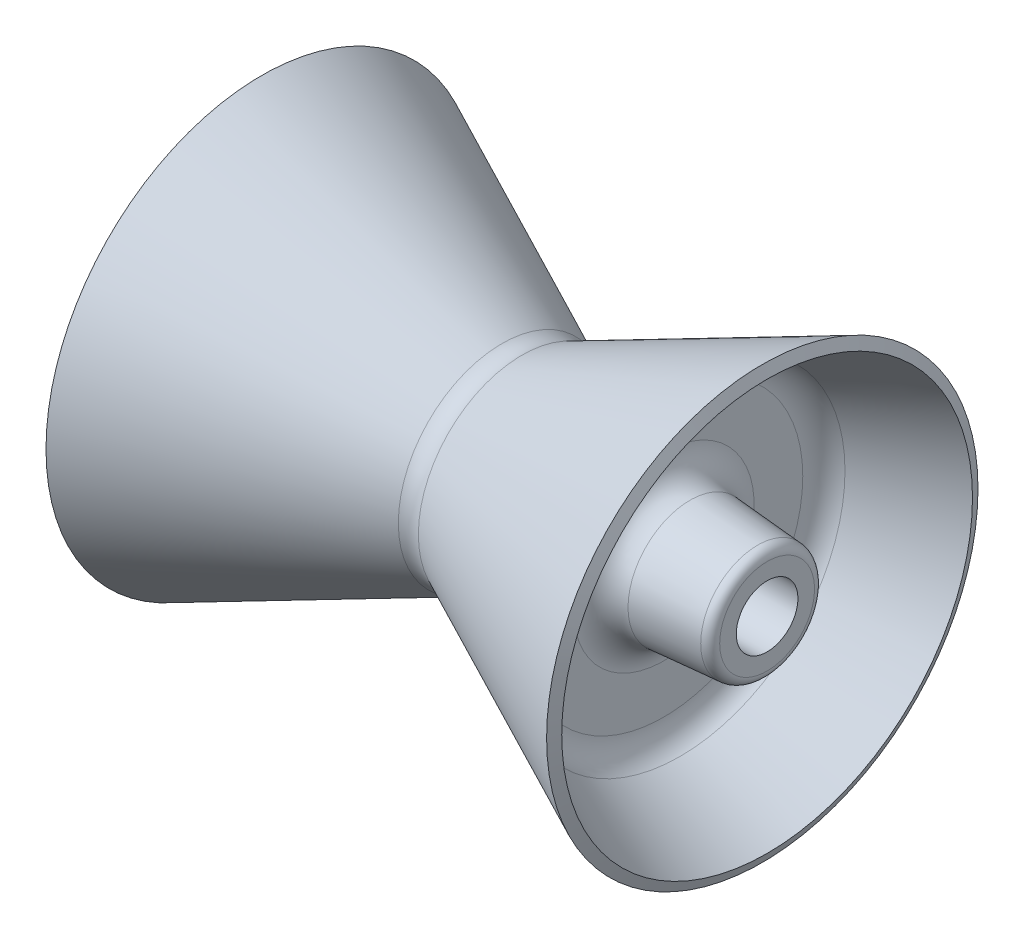
ISO-10303-21;
HEADER;
FILE_DESCRIPTION(('STEP AP214'),'2;1');
FILE_NAME('part.step','',(''),(''),'','','');
FILE_SCHEMA(('AUTOMOTIVE_DESIGN { 1 0 10303 214 1 1 1 1 }'));
ENDSEC;
DATA;
#1=APPLICATION_CONTEXT('core data for automotive mechanical design processes');
#2=APPLICATION_PROTOCOL_DEFINITION('international standard','automotive_design',2000,#1);
#3=PRODUCT_CONTEXT('',#1,'mechanical');
#4=PRODUCT('Part','Part','',(#3));
#5=PRODUCT_RELATED_PRODUCT_CATEGORY('part','',(#4));
#6=PRODUCT_DEFINITION_FORMATION('','',#4);
#7=PRODUCT_DEFINITION_CONTEXT('part definition',#1,'design');
#8=PRODUCT_DEFINITION('design','',#6,#7);
#9=PRODUCT_DEFINITION_SHAPE('','',#8);
#10=(LENGTH_UNIT() NAMED_UNIT(*) SI_UNIT(.MILLI.,.METRE.));
#11=(NAMED_UNIT(*) PLANE_ANGLE_UNIT() SI_UNIT($,.RADIAN.));
#12=(NAMED_UNIT(*) SI_UNIT($,.STERADIAN.) SOLID_ANGLE_UNIT());
#13=UNCERTAINTY_MEASURE_WITH_UNIT(LENGTH_MEASURE(1.E-05),#10,'distance_accuracy_value','');
#14=(GEOMETRIC_REPRESENTATION_CONTEXT(3) GLOBAL_UNCERTAINTY_ASSIGNED_CONTEXT((#13)) GLOBAL_UNIT_ASSIGNED_CONTEXT((#10,
#11,#12)) REPRESENTATION_CONTEXT('',''));
#15=CARTESIAN_POINT('',(0.,0.,0.));
#16=DIRECTION('',(0.,0.,1.));
#17=DIRECTION('',(1.,0.,0.));
#18=AXIS2_PLACEMENT_3D('',#15,#16,#17);
#19=CARTESIAN_POINT('',(130.,32.5,0.));
#20=DIRECTION('',(1.,0.,0.));
#21=DIRECTION('',(0.,0.,-1.));
#22=AXIS2_PLACEMENT_3D('',#19,#20,#21);
#23=PLANE('',#22);
#24=CARTESIAN_POINT('',(130.,0.,0.));
#25=DIRECTION('',(-1.,0.,0.));
#26=DIRECTION('',(0.,0.,1.));
#27=AXIS2_PLACEMENT_3D('',#24,#25,#26);
#28=CIRCLE('',#27,32.5);
#29=CARTESIAN_POINT('',(130.,0.,32.5));
#30=VERTEX_POINT('',#29);
#31=EDGE_CURVE('E10',#30,#30,#28,.T.);
#32=ORIENTED_EDGE('',*,*,#31,.F.);
#33=EDGE_LOOP('',(#32));
#34=FACE_BOUND('',#33,.T.);
#35=CARTESIAN_POINT('',(130.,0.,0.));
#36=DIRECTION('',(-1.,0.,0.));
#37=DIRECTION('',(0.,0.,1.));
#38=AXIS2_PLACEMENT_3D('',#35,#36,#37);
#39=CIRCLE('',#38,104.669980143619);
#40=CARTESIAN_POINT('',(130.,0.,104.669980143619));
#41=VERTEX_POINT('',#40);
#42=EDGE_CURVE('E124',#41,#41,#39,.T.);
#43=ORIENTED_EDGE('',*,*,#42,.T.);
#44=EDGE_LOOP('',(#43));
#45=FACE_BOUND('',#44,.T.);
#46=ADVANCED_FACE('F40',(#34,#45),#23,.F.);
#47=CARTESIAN_POINT('',(-518.63716742877,0.,0.));
#48=DIRECTION('',(-1.,0.,0.));
#49=DIRECTION('',(0.,0.,1.));
#50=AXIS2_PLACEMENT_3D('',#47,#48,#49);
#51=CYLINDRICAL_SURFACE('',#50,32.5);
#52=CARTESIAN_POINT('',(269.015,0.,0.));
#53=DIRECTION('',(-1.,0.,0.));
#54=DIRECTION('',(0.,0.,1.));
#55=AXIS2_PLACEMENT_3D('',#52,#53,#54);
#56=CIRCLE('',#55,32.5);
#57=CARTESIAN_POINT('',(269.015,0.,32.5));
#58=VERTEX_POINT('',#57);
#59=EDGE_CURVE('E43',#58,#58,#56,.T.);
#60=ORIENTED_EDGE('',*,*,#59,.F.);
#61=EDGE_LOOP('',(#60));
#62=FACE_BOUND('',#61,.T.);
#63=ORIENTED_EDGE('',*,*,#31,.T.);
#64=EDGE_LOOP('',(#63));
#65=FACE_BOUND('',#64,.T.);
#66=ADVANCED_FACE('F285',(#62,#65),#51,.F.);
#67=CARTESIAN_POINT('',(269.015,32.5,0.));
#68=DIRECTION('',(-1.,0.,0.));
#69=DIRECTION('',(0.,0.,1.));
#70=AXIS2_PLACEMENT_3D('',#67,#68,#69);
#71=PLANE('',#70);
#72=CARTESIAN_POINT('',(269.015,0.,0.));
#73=DIRECTION('',(-1.,0.,0.));
#74=DIRECTION('',(0.,0.,1.));
#75=AXIS2_PLACEMENT_3D('',#72,#73,#74);
#76=CIRCLE('',#75,50.);
#77=CARTESIAN_POINT('',(269.015,0.,50.));
#78=VERTEX_POINT('',#77);
#79=EDGE_CURVE('E50',#78,#78,#76,.T.);
#80=ORIENTED_EDGE('',*,*,#79,.F.);
#81=EDGE_LOOP('',(#80));
#82=FACE_BOUND('',#81,.T.);
#83=ORIENTED_EDGE('',*,*,#59,.T.);
#84=EDGE_LOOP('',(#83));
#85=FACE_BOUND('',#84,.T.);
#86=ADVANCED_FACE('F280',(#82,#85),#71,.F.);
#87=CARTESIAN_POINT('',(259.015,0.,0.));
#88=DIRECTION('',(-1.,0.,0.));
#89=DIRECTION('',(0.,0.,1.));
#90=AXIS2_PLACEMENT_3D('',#87,#88,#89);
#91=TOROIDAL_SURFACE('',#90,50.,10.);
#92=CARTESIAN_POINT('',(259.015,0.,0.));
#93=DIRECTION('',(-1.,0.,0.));
#94=DIRECTION('',(0.,0.,1.));
#95=AXIS2_PLACEMENT_3D('',#92,#93,#94);
#96=CIRCLE('',#95,60.);
#97=CARTESIAN_POINT('',(259.015,0.,60.));
#98=VERTEX_POINT('',#97);
#99=EDGE_CURVE('E51',#98,#98,#96,.T.);
#100=ORIENTED_EDGE('',*,*,#99,.F.);
#101=EDGE_LOOP('',(#100));
#102=FACE_BOUND('',#101,.T.);
#103=ORIENTED_EDGE('',*,*,#79,.T.);
#104=EDGE_LOOP('',(#103));
#105=FACE_BOUND('',#104,.T.);
#106=ADVANCED_FACE('F271',(#102,#105),#91,.T.);
#107=CARTESIAN_POINT('',(259.015,0.,0.));
#108=DIRECTION('',(-1.,0.,0.));
#109=DIRECTION('',(0.,0.,1.));
#110=AXIS2_PLACEMENT_3D('',#107,#108,#109);
#111=CONICAL_SURFACE('',#110,60.,0.0756017320365091);
#112=CARTESIAN_POINT('',(187.734107976115,0.,0.));
#113=DIRECTION('',(-1.,0.,0.));
#114=DIRECTION('',(0.,0.,1.));
#115=AXIS2_PLACEMENT_3D('',#112,#113,#114);
#116=CIRCLE('',#115,65.3992495094596);
#117=CARTESIAN_POINT('',(187.734107976115,0.,65.3992495094596));
#118=VERTEX_POINT('',#117);
#119=EDGE_CURVE('E57',#118,#118,#116,.T.);
#120=ORIENTED_EDGE('',*,*,#119,.F.);
#121=EDGE_LOOP('',(#120));
#122=FACE_BOUND('',#121,.T.);
#123=ORIENTED_EDGE('',*,*,#99,.T.);
#124=EDGE_LOOP('',(#123));
#125=FACE_BOUND('',#124,.T.);
#126=ADVANCED_FACE('F262',(#122,#125),#111,.T.);
#127=CARTESIAN_POINT('',(190.,0.,0.));
#128=DIRECTION('',(-1.,0.,0.));
#129=DIRECTION('',(0.,0.,1.));
#130=AXIS2_PLACEMENT_3D('',#127,#128,#129);
#131=TOROIDAL_SURFACE('',#130,95.3135560087935,30.);
#132=CARTESIAN_POINT('',(160.,0.,0.));
#133=DIRECTION('',(-1.,0.,0.));
#134=DIRECTION('',(0.,0.,1.));
#135=AXIS2_PLACEMENT_3D('',#132,#133,#134);
#136=CIRCLE('',#135,95.3135560087935);
#137=CARTESIAN_POINT('',(160.,0.,95.3135560087935));
#138=VERTEX_POINT('',#137);
#139=EDGE_CURVE('E56',#138,#138,#136,.T.);
#140=ORIENTED_EDGE('',*,*,#139,.F.);
#141=EDGE_LOOP('',(#140));
#142=FACE_BOUND('',#141,.T.);
#143=ORIENTED_EDGE('',*,*,#119,.T.);
#144=EDGE_LOOP('',(#143));
#145=FACE_BOUND('',#144,.T.);
#146=ADVANCED_FACE('F260',(#142,#145),#131,.F.);
#147=CARTESIAN_POINT('',(160.,95.3135560087937,0.));
#148=DIRECTION('',(-1.,0.,0.));
#149=DIRECTION('',(0.,0.,1.));
#150=AXIS2_PLACEMENT_3D('',#147,#148,#149);
#151=PLANE('',#150);
#152=CARTESIAN_POINT('',(160.,0.,0.));
#153=DIRECTION('',(-1.,0.,0.));
#154=DIRECTION('',(0.,0.,1.));
#155=AXIS2_PLACEMENT_3D('',#152,#153,#154);
#156=CIRCLE('',#155,146.637669377569);
#157=CARTESIAN_POINT('',(160.,0.,146.637669377569));
#158=VERTEX_POINT('',#157);
#159=EDGE_CURVE('E62',#158,#158,#156,.T.);
#160=ORIENTED_EDGE('',*,*,#159,.F.);
#161=EDGE_LOOP('',(#160));
#162=FACE_BOUND('',#161,.T.);
#163=ORIENTED_EDGE('',*,*,#139,.T.);
#164=EDGE_LOOP('',(#163));
#165=FACE_BOUND('',#164,.T.);
#166=ADVANCED_FACE('F254',(#162,#165),#151,.F.);
#167=CARTESIAN_POINT('',(190.,0.,0.));
#168=DIRECTION('',(-1.,0.,0.));
#169=DIRECTION('',(0.,0.,1.));
#170=AXIS2_PLACEMENT_3D('',#167,#168,#169);
#171=TOROIDAL_SURFACE('',#170,146.637669377569,30.);
#172=CARTESIAN_POINT('',(177.321452147779,0.,0.));
#173=DIRECTION('',(-1.,0.,0.));
#174=DIRECTION('',(0.,0.,1.));
#175=AXIS2_PLACEMENT_3D('',#172,#173,#174);
#176=CIRCLE('',#175,173.826902988668);
#177=CARTESIAN_POINT('',(177.321452147779,0.,173.826902988668));
#178=VERTEX_POINT('',#177);
#179=EDGE_CURVE('E65',#178,#178,#176,.T.);
#180=ORIENTED_EDGE('',*,*,#179,.F.);
#181=EDGE_LOOP('',(#180));
#182=FACE_BOUND('',#181,.T.);
#183=ORIENTED_EDGE('',*,*,#159,.T.);
#184=EDGE_LOOP('',(#183));
#185=FACE_BOUND('',#184,.T.);
#186=ADVANCED_FACE('F250',(#182,#185),#171,.F.);
#187=CARTESIAN_POINT('',(177.321452147779,0.,0.));
#188=DIRECTION('',(1.,0.,0.));
#189=DIRECTION('',(0.,0.,-1.));
#190=AXIS2_PLACEMENT_3D('',#187,#188,#189);
#191=CONICAL_SURFACE('',#190,173.826902988668,0.43633231299858);
#192=CARTESIAN_POINT('',(269.015,0.,0.));
#193=DIRECTION('',(-1.,0.,0.));
#194=DIRECTION('',(0.,0.,1.));
#195=AXIS2_PLACEMENT_3D('',#192,#193,#194);
#196=CIRCLE('',#195,216.58430655556);
#197=CARTESIAN_POINT('',(269.015,0.,216.58430655556));
#198=VERTEX_POINT('',#197);
#199=EDGE_CURVE('E66',#198,#198,#196,.T.);
#200=ORIENTED_EDGE('',*,*,#199,.F.);
#201=EDGE_LOOP('',(#200));
#202=FACE_BOUND('',#201,.T.);
#203=ORIENTED_EDGE('',*,*,#179,.T.);
#204=EDGE_LOOP('',(#203));
#205=FACE_BOUND('',#204,.T.);
#206=ADVANCED_FACE('F241',(#202,#205),#191,.F.);
#207=CARTESIAN_POINT('',(269.015,0.,0.));
#208=DIRECTION('',(-1.,0.,0.));
#209=DIRECTION('',(0.,0.,1.));
#210=AXIS2_PLACEMENT_3D('',#207,#208,#209);
#211=CONICAL_SURFACE('',#210,216.58430655556,1.13446401379632);
#212=CARTESIAN_POINT('',(263.943580859112,0.,0.));
#213=DIRECTION('',(-1.,0.,0.));
#214=DIRECTION('',(0.,0.,1.));
#215=AXIS2_PLACEMENT_3D('',#212,#213,#214);
#216=CIRCLE('',#215,227.46);
#217=CARTESIAN_POINT('',(263.943580859112,0.,227.46));
#218=VERTEX_POINT('',#217);
#219=EDGE_CURVE('E71',#218,#218,#216,.T.);
#220=ORIENTED_EDGE('',*,*,#219,.F.);
#221=EDGE_LOOP('',(#220));
#222=FACE_BOUND('',#221,.T.);
#223=ORIENTED_EDGE('',*,*,#199,.T.);
#224=EDGE_LOOP('',(#223));
#225=FACE_BOUND('',#224,.T.);
#226=ADVANCED_FACE('F234',(#222,#225),#211,.T.);
#227=CARTESIAN_POINT('',(263.943580859112,0.,0.));
#228=DIRECTION('',(1.,0.,0.));
#229=DIRECTION('',(0.,0.,-1.));
#230=AXIS2_PLACEMENT_3D('',#227,#228,#229);
#231=CONICAL_SURFACE('',#230,227.46,0.43633231299858);
#232=CARTESIAN_POINT('',(10.5654565435175,0.,0.));
#233=DIRECTION('',(-1.,0.,0.));
#234=DIRECTION('',(0.,0.,1.));
#235=AXIS2_PLACEMENT_3D('',#232,#233,#234);
#236=CIRCLE('',#235,109.30784022269);
#237=CARTESIAN_POINT('',(10.5654565435175,0.,109.30784022269));
#238=VERTEX_POINT('',#237);
#239=EDGE_CURVE('E73',#238,#238,#236,.T.);
#240=ORIENTED_EDGE('',*,*,#239,.F.);
#241=EDGE_LOOP('',(#240));
#242=FACE_BOUND('',#241,.T.);
#243=ORIENTED_EDGE('',*,*,#219,.T.);
#244=EDGE_LOOP('',(#243));
#245=FACE_BOUND('',#244,.T.);
#246=ADVANCED_FACE('F227',(#242,#245),#231,.T.);
#247=CARTESIAN_POINT('',(0.,0.,0.));
#248=DIRECTION('',(-1.,0.,0.));
#249=DIRECTION('',(0.,0.,1.));
#250=AXIS2_PLACEMENT_3D('',#247,#248,#249);
#251=TOROIDAL_SURFACE('',#250,131.965534898606,25.);
#252=CARTESIAN_POINT('',(-10.5654565435175,0.,0.));
#253=DIRECTION('',(-1.,0.,0.));
#254=DIRECTION('',(0.,0.,1.));
#255=AXIS2_PLACEMENT_3D('',#252,#253,#254);
#256=CIRCLE('',#255,109.30784022269);
#257=CARTESIAN_POINT('',(-10.5654565435175,0.,109.30784022269));
#258=VERTEX_POINT('',#257);
#259=EDGE_CURVE('E77',#258,#258,#256,.T.);
#260=ORIENTED_EDGE('',*,*,#259,.F.);
#261=EDGE_LOOP('',(#260));
#262=FACE_BOUND('',#261,.T.);
#263=ORIENTED_EDGE('',*,*,#239,.T.);
#264=EDGE_LOOP('',(#263));
#265=FACE_BOUND('',#264,.T.);
#266=ADVANCED_FACE('F223',(#262,#265),#251,.F.);
#267=CARTESIAN_POINT('',(-10.5654565435175,0.,0.));
#268=DIRECTION('',(-1.,0.,0.));
#269=DIRECTION('',(0.,0.,1.));
#270=AXIS2_PLACEMENT_3D('',#267,#268,#269);
#271=CONICAL_SURFACE('',#270,109.30784022269,0.43633231299858);
#272=CARTESIAN_POINT('',(-263.943580859111,0.,0.));
#273=DIRECTION('',(-1.,0.,0.));
#274=DIRECTION('',(0.,0.,1.));
#275=AXIS2_PLACEMENT_3D('',#272,#273,#274);
#276=CIRCLE('',#275,227.46);
#277=CARTESIAN_POINT('',(-263.943580859111,0.,227.46));
#278=VERTEX_POINT('',#277);
#279=EDGE_CURVE('E79',#278,#278,#276,.T.);
#280=ORIENTED_EDGE('',*,*,#279,.F.);
#281=EDGE_LOOP('',(#280));
#282=FACE_BOUND('',#281,.T.);
#283=ORIENTED_EDGE('',*,*,#259,.T.);
#284=EDGE_LOOP('',(#283));
#285=FACE_BOUND('',#284,.T.);
#286=ADVANCED_FACE('F220',(#282,#285),#271,.T.);
#287=CARTESIAN_POINT('',(-263.943580859111,0.,0.));
#288=DIRECTION('',(1.,0.,0.));
#289=DIRECTION('',(0.,0.,-1.));
#290=AXIS2_PLACEMENT_3D('',#287,#288,#289);
#291=CONICAL_SURFACE('',#290,227.46,1.13446401379632);
#292=CARTESIAN_POINT('',(-269.015,0.,0.));
#293=DIRECTION('',(-1.,0.,0.));
#294=DIRECTION('',(0.,0.,1.));
#295=AXIS2_PLACEMENT_3D('',#292,#293,#294);
#296=CIRCLE('',#295,216.58430655556);
#297=CARTESIAN_POINT('',(-269.015,0.,216.58430655556));
#298=VERTEX_POINT('',#297);
#299=EDGE_CURVE('E81',#298,#298,#296,.T.);
#300=ORIENTED_EDGE('',*,*,#299,.F.);
#301=EDGE_LOOP('',(#300));
#302=FACE_BOUND('',#301,.T.);
#303=ORIENTED_EDGE('',*,*,#279,.T.);
#304=EDGE_LOOP('',(#303));
#305=FACE_BOUND('',#304,.T.);
#306=ADVANCED_FACE('F213',(#302,#305),#291,.T.);
#307=CARTESIAN_POINT('',(-269.015,0.,0.));
#308=DIRECTION('',(-1.,0.,0.));
#309=DIRECTION('',(0.,0.,1.));
#310=AXIS2_PLACEMENT_3D('',#307,#308,#309);
#311=CONICAL_SURFACE('',#310,216.58430655556,0.436332312998579);
#312=CARTESIAN_POINT('',(-177.321452147779,0.,0.));
#313=DIRECTION('',(-1.,0.,0.));
#314=DIRECTION('',(0.,0.,1.));
#315=AXIS2_PLACEMENT_3D('',#312,#313,#314);
#316=CIRCLE('',#315,173.826902988668);
#317=CARTESIAN_POINT('',(-177.321452147779,0.,173.826902988668));
#318=VERTEX_POINT('',#317);
#319=EDGE_CURVE('E86',#318,#318,#316,.T.);
#320=ORIENTED_EDGE('',*,*,#319,.F.);
#321=EDGE_LOOP('',(#320));
#322=FACE_BOUND('',#321,.T.);
#323=ORIENTED_EDGE('',*,*,#299,.T.);
#324=EDGE_LOOP('',(#323));
#325=FACE_BOUND('',#324,.T.);
#326=ADVANCED_FACE('F203',(#322,#325),#311,.F.);
#327=CARTESIAN_POINT('',(-190.,0.,0.));
#328=DIRECTION('',(-1.,0.,0.));
#329=DIRECTION('',(0.,0.,1.));
#330=AXIS2_PLACEMENT_3D('',#327,#328,#329);
#331=TOROIDAL_SURFACE('',#330,146.637669377569,30.);
#332=CARTESIAN_POINT('',(-160.,0.,0.));
#333=DIRECTION('',(-1.,0.,0.));
#334=DIRECTION('',(0.,0.,1.));
#335=AXIS2_PLACEMENT_3D('',#332,#333,#334);
#336=CIRCLE('',#335,146.637669377569);
#337=CARTESIAN_POINT('',(-160.,0.,146.637669377569));
#338=VERTEX_POINT('',#337);
#339=EDGE_CURVE('E87',#338,#338,#336,.T.);
#340=ORIENTED_EDGE('',*,*,#339,.F.);
#341=EDGE_LOOP('',(#340));
#342=FACE_BOUND('',#341,.T.);
#343=ORIENTED_EDGE('',*,*,#319,.T.);
#344=EDGE_LOOP('',(#343));
#345=FACE_BOUND('',#344,.T.);
#346=ADVANCED_FACE('F198',(#342,#345),#331,.F.);
#347=CARTESIAN_POINT('',(-160.,95.3135560087937,0.));
#348=DIRECTION('',(1.,0.,0.));
#349=DIRECTION('',(0.,0.,-1.));
#350=AXIS2_PLACEMENT_3D('',#347,#348,#349);
#351=PLANE('',#350);
#352=CARTESIAN_POINT('',(-160.,0.,0.));
#353=DIRECTION('',(-1.,0.,0.));
#354=DIRECTION('',(0.,0.,1.));
#355=AXIS2_PLACEMENT_3D('',#352,#353,#354);
#356=CIRCLE('',#355,95.3135560087937);
#357=CARTESIAN_POINT('',(-160.,0.,95.3135560087937));
#358=VERTEX_POINT('',#357);
#359=EDGE_CURVE('E95',#358,#358,#356,.T.);
#360=ORIENTED_EDGE('',*,*,#359,.F.);
#361=EDGE_LOOP('',(#360));
#362=FACE_BOUND('',#361,.T.);
#363=ORIENTED_EDGE('',*,*,#339,.T.);
#364=EDGE_LOOP('',(#363));
#365=FACE_BOUND('',#364,.T.);
#366=ADVANCED_FACE('F194',(#362,#365),#351,.F.);
#367=CARTESIAN_POINT('',(-190.,0.,0.));
#368=DIRECTION('',(-1.,0.,0.));
#369=DIRECTION('',(0.,0.,1.));
#370=AXIS2_PLACEMENT_3D('',#367,#368,#369);
#371=TOROIDAL_SURFACE('',#370,95.3135560087935,30.);
#372=CARTESIAN_POINT('',(-187.734107976115,0.,0.));
#373=DIRECTION('',(-1.,0.,0.));
#374=DIRECTION('',(0.,0.,1.));
#375=AXIS2_PLACEMENT_3D('',#372,#373,#374);
#376=CIRCLE('',#375,65.3992495094596);
#377=CARTESIAN_POINT('',(-187.734107976115,0.,65.3992495094596));
#378=VERTEX_POINT('',#377);
#379=EDGE_CURVE('E94',#378,#378,#376,.T.);
#380=ORIENTED_EDGE('',*,*,#379,.F.);
#381=EDGE_LOOP('',(#380));
#382=FACE_BOUND('',#381,.T.);
#383=ORIENTED_EDGE('',*,*,#359,.T.);
#384=EDGE_LOOP('',(#383));
#385=FACE_BOUND('',#384,.T.);
#386=ADVANCED_FACE('F190',(#382,#385),#371,.F.);
#387=CARTESIAN_POINT('',(-187.734107976115,0.,0.));
#388=DIRECTION('',(1.,0.,0.));
#389=DIRECTION('',(0.,0.,-1.));
#390=AXIS2_PLACEMENT_3D('',#387,#388,#389);
#391=CONICAL_SURFACE('',#390,65.3992495094596,0.0756017320365089);
#392=CARTESIAN_POINT('',(-259.015,0.,0.));
#393=DIRECTION('',(-1.,0.,0.));
#394=DIRECTION('',(0.,0.,1.));
#395=AXIS2_PLACEMENT_3D('',#392,#393,#394);
#396=CIRCLE('',#395,60.);
#397=CARTESIAN_POINT('',(-259.015,0.,60.));
#398=VERTEX_POINT('',#397);
#399=EDGE_CURVE('E97',#398,#398,#396,.T.);
#400=ORIENTED_EDGE('',*,*,#399,.F.);
#401=EDGE_LOOP('',(#400));
#402=FACE_BOUND('',#401,.T.);
#403=ORIENTED_EDGE('',*,*,#379,.T.);
#404=EDGE_LOOP('',(#403));
#405=FACE_BOUND('',#404,.T.);
#406=ADVANCED_FACE('F181',(#402,#405),#391,.T.);
#407=CARTESIAN_POINT('',(-259.015,0.,0.));
#408=DIRECTION('',(-1.,0.,0.));
#409=DIRECTION('',(0.,0.,1.));
#410=AXIS2_PLACEMENT_3D('',#407,#408,#409);
#411=TOROIDAL_SURFACE('',#410,50.,10.);
#412=CARTESIAN_POINT('',(-269.015,0.,0.));
#413=DIRECTION('',(-1.,0.,0.));
#414=DIRECTION('',(0.,0.,1.));
#415=AXIS2_PLACEMENT_3D('',#412,#413,#414);
#416=CIRCLE('',#415,50.);
#417=CARTESIAN_POINT('',(-269.015,0.,50.));
#418=VERTEX_POINT('',#417);
#419=EDGE_CURVE('E102',#418,#418,#416,.T.);
#420=ORIENTED_EDGE('',*,*,#419,.F.);
#421=EDGE_LOOP('',(#420));
#422=FACE_BOUND('',#421,.T.);
#423=ORIENTED_EDGE('',*,*,#399,.T.);
#424=EDGE_LOOP('',(#423));
#425=FACE_BOUND('',#424,.T.);
#426=ADVANCED_FACE('F172',(#422,#425),#411,.T.);
#427=CARTESIAN_POINT('',(-269.015,32.5,0.));
#428=DIRECTION('',(1.,0.,0.));
#429=DIRECTION('',(0.,0.,-1.));
#430=AXIS2_PLACEMENT_3D('',#427,#428,#429);
#431=PLANE('',#430);
#432=CARTESIAN_POINT('',(-269.015,0.,0.));
#433=DIRECTION('',(-1.,0.,0.));
#434=DIRECTION('',(0.,0.,1.));
#435=AXIS2_PLACEMENT_3D('',#432,#433,#434);
#436=CIRCLE('',#435,32.5);
#437=CARTESIAN_POINT('',(-269.015,0.,32.5));
#438=VERTEX_POINT('',#437);
#439=EDGE_CURVE('E101',#438,#438,#436,.T.);
#440=ORIENTED_EDGE('',*,*,#439,.F.);
#441=EDGE_LOOP('',(#440));
#442=FACE_BOUND('',#441,.T.);
#443=ORIENTED_EDGE('',*,*,#419,.T.);
#444=EDGE_LOOP('',(#443));
#445=FACE_BOUND('',#444,.T.);
#446=ADVANCED_FACE('F170',(#442,#445),#431,.F.);
#447=CARTESIAN_POINT('',(-518.63716742877,0.,0.));
#448=DIRECTION('',(-1.,0.,0.));
#449=DIRECTION('',(0.,0.,1.));
#450=AXIS2_PLACEMENT_3D('',#447,#448,#449);
#451=CYLINDRICAL_SURFACE('',#450,32.5);
#452=CARTESIAN_POINT('',(-130.,0.,0.));
#453=DIRECTION('',(-1.,0.,0.));
#454=DIRECTION('',(0.,0.,1.));
#455=AXIS2_PLACEMENT_3D('',#452,#453,#454);
#456=CIRCLE('',#455,32.5);
#457=CARTESIAN_POINT('',(-130.,0.,32.5));
#458=VERTEX_POINT('',#457);
#459=EDGE_CURVE('E107',#458,#458,#456,.T.);
#460=ORIENTED_EDGE('',*,*,#459,.F.);
#461=EDGE_LOOP('',(#460));
#462=FACE_BOUND('',#461,.T.);
#463=ORIENTED_EDGE('',*,*,#439,.T.);
#464=EDGE_LOOP('',(#463));
#465=FACE_BOUND('',#464,.T.);
#466=ADVANCED_FACE('F164',(#462,#465),#451,.F.);
#467=CARTESIAN_POINT('',(-130.,32.5,0.));
#468=DIRECTION('',(-1.,0.,0.));
#469=DIRECTION('',(0.,0.,1.));
#470=AXIS2_PLACEMENT_3D('',#467,#468,#469);
#471=PLANE('',#470);
#472=CARTESIAN_POINT('',(-130.,0.,0.));
#473=DIRECTION('',(-1.,0.,0.));
#474=DIRECTION('',(0.,0.,1.));
#475=AXIS2_PLACEMENT_3D('',#472,#473,#474);
#476=CIRCLE('',#475,104.669980143619);
#477=CARTESIAN_POINT('',(-130.,0.,104.669980143619));
#478=VERTEX_POINT('',#477);
#479=EDGE_CURVE('E110',#478,#478,#476,.T.);
#480=ORIENTED_EDGE('',*,*,#479,.F.);
#481=EDGE_LOOP('',(#480));
#482=FACE_BOUND('',#481,.T.);
#483=ORIENTED_EDGE('',*,*,#459,.T.);
#484=EDGE_LOOP('',(#483));
#485=FACE_BOUND('',#484,.T.);
#486=ADVANCED_FACE('F160',(#482,#485),#471,.F.);
#487=CARTESIAN_POINT('',(-99.9999999999999,0.,0.));
#488=DIRECTION('',(-1.,0.,0.));
#489=DIRECTION('',(0.,0.,1.));
#490=AXIS2_PLACEMENT_3D('',#487,#488,#489);
#491=TOROIDAL_SURFACE('',#490,104.669980143619,29.9999999999999);
#492=CARTESIAN_POINT('',(-87.321452147779,0.,0.));
#493=DIRECTION('',(-1.,0.,0.));
#494=DIRECTION('',(0.,0.,1.));
#495=AXIS2_PLACEMENT_3D('',#492,#493,#494);
#496=CIRCLE('',#495,131.859213754718);
#497=CARTESIAN_POINT('',(-87.321452147779,0.,131.859213754718));
#498=VERTEX_POINT('',#497);
#499=EDGE_CURVE('E111',#498,#498,#496,.T.);
#500=ORIENTED_EDGE('',*,*,#499,.F.);
#501=EDGE_LOOP('',(#500));
#502=FACE_BOUND('',#501,.T.);
#503=ORIENTED_EDGE('',*,*,#479,.T.);
#504=EDGE_LOOP('',(#503));
#505=FACE_BOUND('',#504,.T.);
#506=ADVANCED_FACE('F151',(#502,#505),#491,.F.);
#507=CARTESIAN_POINT('',(-87.321452147779,0.,0.));
#508=DIRECTION('',(-1.,0.,0.));
#509=DIRECTION('',(0.,0.,1.));
#510=AXIS2_PLACEMENT_3D('',#507,#508,#509);
#511=CONICAL_SURFACE('',#510,131.859213754718,0.43633231299858);
#512=CARTESIAN_POINT('',(-10.5654565435175,0.,0.));
#513=DIRECTION('',(-1.,0.,0.));
#514=DIRECTION('',(0.,0.,1.));
#515=AXIS2_PLACEMENT_3D('',#512,#513,#514);
#516=CIRCLE('',#515,96.0673051951401);
#517=CARTESIAN_POINT('',(-10.5654565435175,0.,96.0673051951401));
#518=VERTEX_POINT('',#517);
#519=EDGE_CURVE('E116',#518,#518,#516,.T.);
#520=ORIENTED_EDGE('',*,*,#519,.F.);
#521=EDGE_LOOP('',(#520));
#522=FACE_BOUND('',#521,.T.);
#523=ORIENTED_EDGE('',*,*,#499,.T.);
#524=EDGE_LOOP('',(#523));
#525=FACE_BOUND('',#524,.T.);
#526=ADVANCED_FACE('F144',(#522,#525),#511,.F.);
#527=CARTESIAN_POINT('',(0.,0.,0.));
#528=DIRECTION('',(-1.,0.,0.));
#529=DIRECTION('',(0.,0.,1.));
#530=AXIS2_PLACEMENT_3D('',#527,#528,#529);
#531=TOROIDAL_SURFACE('',#530,118.724999871056,25.);
#532=CARTESIAN_POINT('',(10.5654565435176,0.,0.));
#533=DIRECTION('',(-1.,0.,0.));
#534=DIRECTION('',(0.,0.,1.));
#535=AXIS2_PLACEMENT_3D('',#532,#533,#534);
#536=CIRCLE('',#535,96.0673051951401);
#537=CARTESIAN_POINT('',(10.5654565435176,0.,96.0673051951401));
#538=VERTEX_POINT('',#537);
#539=EDGE_CURVE('E118',#538,#538,#536,.T.);
#540=ORIENTED_EDGE('',*,*,#539,.F.);
#541=EDGE_LOOP('',(#540));
#542=FACE_BOUND('',#541,.T.);
#543=ORIENTED_EDGE('',*,*,#519,.T.);
#544=EDGE_LOOP('',(#543));
#545=FACE_BOUND('',#544,.T.);
#546=ADVANCED_FACE('F137',(#542,#545),#531,.T.);
#547=CARTESIAN_POINT('',(10.5654565435176,0.,0.));
#548=DIRECTION('',(1.,0.,0.));
#549=DIRECTION('',(0.,0.,-1.));
#550=AXIS2_PLACEMENT_3D('',#547,#548,#549);
#551=CONICAL_SURFACE('',#550,96.0673051951401,0.43633231299858);
#552=CARTESIAN_POINT('',(87.3214521477792,0.,0.));
#553=DIRECTION('',(-1.,0.,0.));
#554=DIRECTION('',(0.,0.,1.));
#555=AXIS2_PLACEMENT_3D('',#552,#553,#554);
#556=CIRCLE('',#555,131.859213754718);
#557=CARTESIAN_POINT('',(87.3214521477792,0.,131.859213754718));
#558=VERTEX_POINT('',#557);
#559=EDGE_CURVE('E122',#558,#558,#556,.T.);
#560=ORIENTED_EDGE('',*,*,#559,.F.);
#561=EDGE_LOOP('',(#560));
#562=FACE_BOUND('',#561,.T.);
#563=ORIENTED_EDGE('',*,*,#539,.T.);
#564=EDGE_LOOP('',(#563));
#565=FACE_BOUND('',#564,.T.);
#566=ADVANCED_FACE('F133',(#562,#565),#551,.F.);
#567=CARTESIAN_POINT('',(100.,0.,0.));
#568=DIRECTION('',(-1.,0.,0.));
#569=DIRECTION('',(0.,0.,1.));
#570=AXIS2_PLACEMENT_3D('',#567,#568,#569);
#571=TOROIDAL_SURFACE('',#570,104.669980143619,30.);
#572=ORIENTED_EDGE('',*,*,#42,.F.);
#573=EDGE_LOOP('',(#572));
#574=FACE_BOUND('',#573,.T.);
#575=ORIENTED_EDGE('',*,*,#559,.T.);
#576=EDGE_LOOP('',(#575));
#577=FACE_BOUND('',#576,.T.);
#578=ADVANCED_FACE('F127',(#574,#577),#571,.F.);
#579=CLOSED_SHELL('',(#46,#66,#86,#106,#126,#146,#166,#186,#206,#226,#246,#266,#286,#306,#326,
#346,#366,#386,#406,#426,#446,#466,#486,#506,#526,#546,#566,#578));
#580=MANIFOLD_SOLID_BREP('B2',#579);
#581=ADVANCED_BREP_SHAPE_REPRESENTATION('',(#18,#580),#14);
#582=SHAPE_DEFINITION_REPRESENTATION(#9,#581);
ENDSEC;
END-ISO-10303-21;
